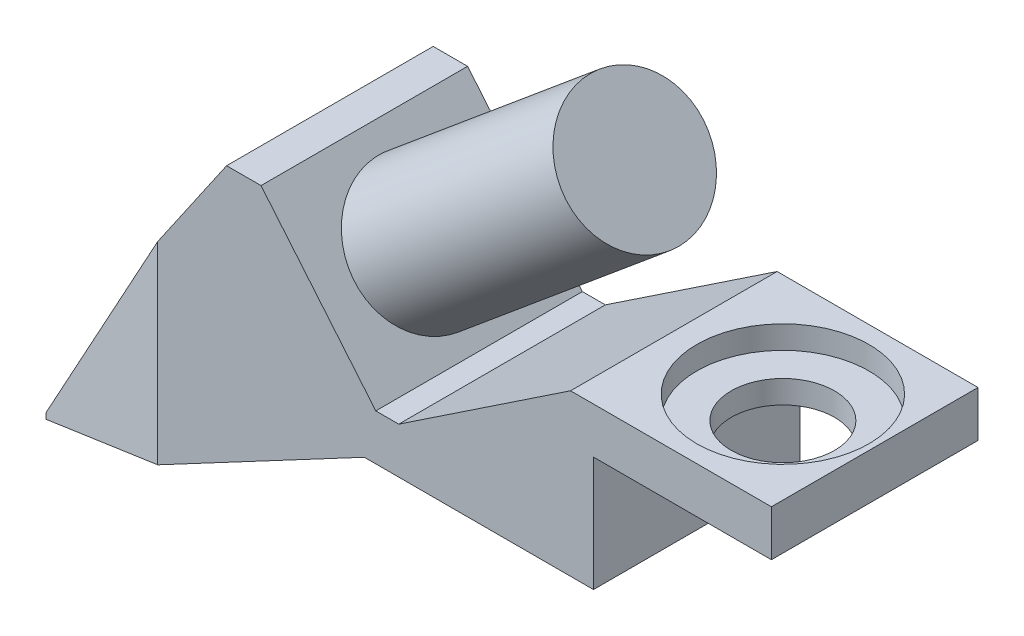
ISO-10303-21;
HEADER;
FILE_DESCRIPTION(('STEP AP214'),'2;1');
FILE_NAME('part.step','',(''),(''),'','','');
FILE_SCHEMA(('AUTOMOTIVE_DESIGN { 1 0 10303 214 1 1 1 1 }'));
ENDSEC;
DATA;
#1=APPLICATION_CONTEXT('core data for automotive mechanical design processes');
#2=APPLICATION_PROTOCOL_DEFINITION('international standard','automotive_design',2000,#1);
#3=PRODUCT_CONTEXT('',#1,'mechanical');
#4=PRODUCT('Part','Part','',(#3));
#5=PRODUCT_RELATED_PRODUCT_CATEGORY('part','',(#4));
#6=PRODUCT_DEFINITION_FORMATION('','',#4);
#7=PRODUCT_DEFINITION_CONTEXT('part definition',#1,'design');
#8=PRODUCT_DEFINITION('design','',#6,#7);
#9=PRODUCT_DEFINITION_SHAPE('','',#8);
#10=(LENGTH_UNIT() NAMED_UNIT(*) SI_UNIT(.MILLI.,.METRE.));
#11=(NAMED_UNIT(*) PLANE_ANGLE_UNIT() SI_UNIT($,.RADIAN.));
#12=(NAMED_UNIT(*) SI_UNIT($,.STERADIAN.) SOLID_ANGLE_UNIT());
#13=UNCERTAINTY_MEASURE_WITH_UNIT(LENGTH_MEASURE(1.E-05),#10,'distance_accuracy_value','');
#14=(GEOMETRIC_REPRESENTATION_CONTEXT(3) GLOBAL_UNCERTAINTY_ASSIGNED_CONTEXT((#13)) GLOBAL_UNIT_ASSIGNED_CONTEXT((#10,
#11,#12)) REPRESENTATION_CONTEXT('',''));
#15=CARTESIAN_POINT('',(0.,0.,0.));
#16=DIRECTION('',(0.,0.,1.));
#17=DIRECTION('',(1.,0.,0.));
#18=AXIS2_PLACEMENT_3D('',#15,#16,#17);
#19=CARTESIAN_POINT('',(31.6,0.,4.5));
#20=DIRECTION('',(0.,1.,0.));
#21=DIRECTION('',(0.,0.,1.));
#22=AXIS2_PLACEMENT_3D('',#19,#20,#21);
#23=CYLINDRICAL_SURFACE('',#22,2.25);
#24=CARTESIAN_POINT('',(31.6,14.5,4.5));
#25=DIRECTION('',(0.,1.,0.));
#26=DIRECTION('',(0.,0.,1.));
#27=AXIS2_PLACEMENT_3D('',#24,#25,#26);
#28=CIRCLE('',#27,2.25);
#29=CARTESIAN_POINT('',(31.6,14.5,6.75));
#30=VERTEX_POINT('',#29);
#31=EDGE_CURVE('E186',#30,#30,#28,.T.);
#32=ORIENTED_EDGE('',*,*,#31,.F.);
#33=EDGE_LOOP('',(#32));
#34=FACE_BOUND('',#33,.T.);
#35=CARTESIAN_POINT('',(31.6,15.5,4.5));
#36=DIRECTION('',(0.,1.,0.));
#37=DIRECTION('',(0.,0.,1.));
#38=AXIS2_PLACEMENT_3D('',#35,#36,#37);
#39=CIRCLE('',#38,2.25);
#40=CARTESIAN_POINT('',(31.6,15.5,6.75));
#41=VERTEX_POINT('',#40);
#42=EDGE_CURVE('E339',#41,#41,#39,.T.);
#43=ORIENTED_EDGE('',*,*,#42,.T.);
#44=EDGE_LOOP('',(#43));
#45=FACE_BOUND('',#44,.T.);
#46=ADVANCED_FACE('F41',(#34,#45),#23,.F.);
#47=CARTESIAN_POINT('',(0.,0.,9.));
#48=DIRECTION('',(1.,0.,0.));
#49=DIRECTION('',(0.,0.,-1.));
#50=AXIS2_PLACEMENT_3D('',#47,#48,#49);
#51=PLANE('',#50);
#52=DIRECTION('',(0.,0.,-1.));
#53=VECTOR('',#52,1.);
#54=CARTESIAN_POINT('',(0.,0.25,9.));
#55=LINE('',#54,#53);
#56=CARTESIAN_POINT('',(0.,0.25,5.));
#57=VERTEX_POINT('',#56);
#58=CARTESIAN_POINT('',(0.,0.250000000000007,4.));
#59=VERTEX_POINT('',#58);
#60=EDGE_CURVE('E156',#57,#59,#55,.T.);
#61=ORIENTED_EDGE('',*,*,#60,.T.);
#62=DIRECTION('',(0.,1.,0.));
#63=VECTOR('',#62,1.);
#64=CARTESIAN_POINT('',(0.,0.,4.));
#65=LINE('',#64,#63);
#66=CARTESIAN_POINT('',(0.,0.,4.));
#67=VERTEX_POINT('',#66);
#68=EDGE_CURVE('E143',#67,#59,#65,.T.);
#69=ORIENTED_EDGE('',*,*,#68,.F.);
#70=DIRECTION('',(0.,0.,-1.));
#71=VECTOR('',#70,1.);
#72=CARTESIAN_POINT('',(0.,0.,9.));
#73=LINE('',#72,#71);
#74=CARTESIAN_POINT('',(0.,0.,5.));
#75=VERTEX_POINT('',#74);
#76=EDGE_CURVE('E154',#75,#67,#73,.T.);
#77=ORIENTED_EDGE('',*,*,#76,.F.);
#78=DIRECTION('',(0.,1.,0.));
#79=VECTOR('',#78,1.);
#80=CARTESIAN_POINT('',(0.,0.,5.));
#81=LINE('',#80,#79);
#82=EDGE_CURVE('E157',#75,#57,#81,.T.);
#83=ORIENTED_EDGE('',*,*,#82,.T.);
#84=EDGE_LOOP('',(#61,#69,#77,#83));
#85=FACE_BOUND('',#84,.T.);
#86=ADVANCED_FACE('F43',(#85),#51,.F.);
#87=CARTESIAN_POINT('',(0.,0.,9.));
#88=DIRECTION('',(-0.469475991500932,0.882945238055122,0.));
#89=DIRECTION('',(-0.882945238055122,-0.469475991500932,0.));
#90=AXIS2_PLACEMENT_3D('',#87,#88,#89);
#91=PLANE('',#90);
#92=ORIENTED_EDGE('',*,*,#76,.T.);
#93=DIRECTION('',(0.820268310076232,0.436149674489542,-0.37004507958808));
#94=VECTOR('',#93,1.);
#95=CARTESIAN_POINT('',(-1.5176812604287,-0.80697520504399,4.68466680463674));
#96=LINE('',#95,#94);
#97=CARTESIAN_POINT('',(8.86668522645211,4.71455720989505,0.));
#98=VERTEX_POINT('',#97);
#99=EDGE_CURVE('E140',#67,#98,#96,.T.);
#100=ORIENTED_EDGE('',*,*,#99,.T.);
#101=DIRECTION('',(0.882945238055122,0.469475991500932,0.));
#102=VECTOR('',#101,1.);
#103=CARTESIAN_POINT('',(0.,0.,0.));
#104=LINE('',#103,#102);
#105=CARTESIAN_POINT('',(17.8666852264521,9.5,0.));
#106=VERTEX_POINT('',#105);
#107=EDGE_CURVE('E205',#98,#106,#104,.T.);
#108=ORIENTED_EDGE('',*,*,#107,.T.);
#109=DIRECTION('',(0.,0.,-1.));
#110=VECTOR('',#109,1.);
#111=CARTESIAN_POINT('',(17.8666852264521,9.5,9.));
#112=LINE('',#111,#110);
#113=CARTESIAN_POINT('',(17.8666852264521,9.5,9.));
#114=VERTEX_POINT('',#113);
#115=EDGE_CURVE('E161',#114,#106,#112,.T.);
#116=ORIENTED_EDGE('',*,*,#115,.F.);
#117=DIRECTION('',(0.882945238055122,0.469475991500932,0.));
#118=VECTOR('',#117,1.);
#119=CARTESIAN_POINT('',(0.,0.,9.));
#120=LINE('',#119,#118);
#121=CARTESIAN_POINT('',(8.86668522645211,4.71455720989504,9.));
#122=VERTEX_POINT('',#121);
#123=EDGE_CURVE('E171',#122,#114,#120,.T.);
#124=ORIENTED_EDGE('',*,*,#123,.F.);
#125=DIRECTION('',(0.820268310076232,0.436149674489542,0.37004507958808));
#126=VECTOR('',#125,1.);
#127=CARTESIAN_POINT('',(1.21414500834296,0.645580164035192,5.54773344370939));
#128=LINE('',#127,#126);
#129=EDGE_CURVE('E56',#75,#122,#128,.T.);
#130=ORIENTED_EDGE('',*,*,#129,.F.);
#131=EDGE_LOOP('',(#92,#100,#108,#116,#124,#130));
#132=FACE_BOUND('',#131,.T.);
#133=ADVANCED_FACE('F159',(#132),#91,.F.);
#134=CARTESIAN_POINT('',(11.8666852264521,17.5,9.));
#135=DIRECTION('',(0.823878894288954,-0.566765884246054,0.));
#136=DIRECTION('',(0.566765884246054,0.823878894288954,0.));
#137=AXIS2_PLACEMENT_3D('',#134,#135,#136);
#138=PLANE('',#137);
#139=DIRECTION('',(-0.566765884246054,-0.823878894288954,0.));
#140=VECTOR('',#139,1.);
#141=CARTESIAN_POINT('',(11.8666852264521,17.5,0.));
#142=LINE('',#141,#140);
#143=CARTESIAN_POINT('',(11.8666852264521,17.5,0.));
#144=VERTEX_POINT('',#143);
#145=CARTESIAN_POINT('',(8.86668522645211,13.1390517644604,0.));
#146=VERTEX_POINT('',#145);
#147=EDGE_CURVE('E178',#144,#146,#142,.T.);
#148=ORIENTED_EDGE('',*,*,#147,.T.);
#149=DIRECTION('',(-0.549101539759478,-0.798201130315389,0.247714461824509));
#150=VECTOR('',#149,1.);
#151=CARTESIAN_POINT('',(10.4584143309843,15.4528678410827,-0.718071777165876));
#152=LINE('',#151,#150);
#153=EDGE_CURVE('E64',#146,#59,#152,.T.);
#154=ORIENTED_EDGE('',*,*,#153,.T.);
#155=ORIENTED_EDGE('',*,*,#60,.F.);
#156=DIRECTION('',(-0.549101539759478,-0.798201130315389,-0.247714461824509));
#157=VECTOR('',#156,1.);
#158=CARTESIAN_POINT('',(11.6825978626611,17.2324015118968,10.2703338685389));
#159=LINE('',#158,#157);
#160=CARTESIAN_POINT('',(8.86668522645211,13.1390517644604,9.));
#161=VERTEX_POINT('',#160);
#162=EDGE_CURVE('E148',#161,#57,#159,.T.);
#163=ORIENTED_EDGE('',*,*,#162,.F.);
#164=DIRECTION('',(-0.566765884246054,-0.823878894288954,0.));
#165=VECTOR('',#164,1.);
#166=CARTESIAN_POINT('',(11.8666852264521,17.5,9.));
#167=LINE('',#166,#165);
#168=CARTESIAN_POINT('',(11.8666852264521,17.5,9.));
#169=VERTEX_POINT('',#168);
#170=EDGE_CURVE('E174',#169,#161,#167,.T.);
#171=ORIENTED_EDGE('',*,*,#170,.F.);
#172=DIRECTION('',(0.,0.,-1.));
#173=VECTOR('',#172,1.);
#174=CARTESIAN_POINT('',(11.8666852264521,17.5,9.));
#175=LINE('',#174,#173);
#176=EDGE_CURVE('E225',#169,#144,#175,.T.);
#177=ORIENTED_EDGE('',*,*,#176,.T.);
#178=EDGE_LOOP('',(#148,#154,#155,#163,#171,#177));
#179=FACE_BOUND('',#178,.T.);
#180=ADVANCED_FACE('F280',(#179),#138,.F.);
#181=CARTESIAN_POINT('',(0.,0.,9.));
#182=DIRECTION('',(0.,0.,1.));
#183=DIRECTION('',(1.,0.,0.));
#184=AXIS2_PLACEMENT_3D('',#181,#182,#183);
#185=PLANE('',#184);
#186=ORIENTED_EDGE('',*,*,#170,.T.);
#187=DIRECTION('',(0.,-1.,0.));
#188=VECTOR('',#187,1.);
#189=CARTESIAN_POINT('',(8.86668522645211,0.,9.));
#190=LINE('',#189,#188);
#191=EDGE_CURVE('E49',#161,#122,#190,.T.);
#192=ORIENTED_EDGE('',*,*,#191,.T.);
#193=ORIENTED_EDGE('',*,*,#123,.T.);
#194=DIRECTION('',(1.,0.,0.));
#195=VECTOR('',#194,1.);
#196=CARTESIAN_POINT('',(17.8666852264521,9.5,9.));
#197=LINE('',#196,#195);
#198=CARTESIAN_POINT('',(27.85,9.5,9.));
#199=VERTEX_POINT('',#198);
#200=EDGE_CURVE('E177',#114,#199,#197,.T.);
#201=ORIENTED_EDGE('',*,*,#200,.T.);
#202=DIRECTION('',(0.,1.,0.));
#203=VECTOR('',#202,1.);
#204=CARTESIAN_POINT('',(27.85,9.5,9.));
#205=LINE('',#204,#203);
#206=CARTESIAN_POINT('',(27.85,14.5,9.));
#207=VERTEX_POINT('',#206);
#208=EDGE_CURVE('E180',#199,#207,#205,.T.);
#209=ORIENTED_EDGE('',*,*,#208,.T.);
#210=DIRECTION('',(1.,0.,0.));
#211=VECTOR('',#210,1.);
#212=CARTESIAN_POINT('',(27.85,14.5,9.));
#213=LINE('',#212,#211);
#214=CARTESIAN_POINT('',(35.6,14.5,9.));
#215=VERTEX_POINT('',#214);
#216=EDGE_CURVE('E190',#207,#215,#213,.T.);
#217=ORIENTED_EDGE('',*,*,#216,.T.);
#218=DIRECTION('',(0.,1.,0.));
#219=VECTOR('',#218,1.);
#220=CARTESIAN_POINT('',(35.6,14.5,9.));
#221=LINE('',#220,#219);
#222=CARTESIAN_POINT('',(35.6,16.5,9.));
#223=VERTEX_POINT('',#222);
#224=EDGE_CURVE('E192',#215,#223,#221,.T.);
#225=ORIENTED_EDGE('',*,*,#224,.T.);
#226=DIRECTION('',(-1.,0.,0.));
#227=VECTOR('',#226,1.);
#228=CARTESIAN_POINT('',(35.6,16.5,9.));
#229=LINE('',#228,#227);
#230=CARTESIAN_POINT('',(26.85,16.5,9.));
#231=VERTEX_POINT('',#230);
#232=EDGE_CURVE('E194',#223,#231,#229,.T.);
#233=ORIENTED_EDGE('',*,*,#232,.T.);
#234=DIRECTION('',(-0.831479419283098,-0.555555555555556,0.));
#235=VECTOR('',#234,1.);
#236=CARTESIAN_POINT('',(26.85,16.5,9.));
#237=LINE('',#236,#235);
#238=CARTESIAN_POINT('',(19.3666852264521,11.5,9.));
#239=VERTEX_POINT('',#238);
#240=EDGE_CURVE('E196',#231,#239,#237,.T.);
#241=ORIENTED_EDGE('',*,*,#240,.T.);
#242=DIRECTION('',(-1.,0.,0.));
#243=VECTOR('',#242,1.);
#244=CARTESIAN_POINT('',(19.3666852264521,11.5,9.));
#245=LINE('',#244,#243);
#246=CARTESIAN_POINT('',(18.3666852264521,11.5,9.));
#247=VERTEX_POINT('',#246);
#248=EDGE_CURVE('E198',#239,#247,#245,.T.);
#249=ORIENTED_EDGE('',*,*,#248,.T.);
#250=DIRECTION('',(-0.64018439966448,0.768221279597376,0.));
#251=VECTOR('',#250,1.);
#252=CARTESIAN_POINT('',(18.3666852264521,11.5,9.));
#253=LINE('',#252,#251);
#254=CARTESIAN_POINT('',(13.3666852264521,17.5,9.));
#255=VERTEX_POINT('',#254);
#256=EDGE_CURVE('E200',#247,#255,#253,.T.);
#257=ORIENTED_EDGE('',*,*,#256,.T.);
#258=DIRECTION('',(-1.,0.,0.));
#259=VECTOR('',#258,1.);
#260=CARTESIAN_POINT('',(13.3666852264521,17.5,9.));
#261=LINE('',#260,#259);
#262=EDGE_CURVE('E202',#255,#169,#261,.T.);
#263=ORIENTED_EDGE('',*,*,#262,.T.);
#264=EDGE_LOOP('',(#186,#192,#193,#201,#209,#217,#225,#233,#241,#249,#257,#263));
#265=FACE_BOUND('',#264,.T.);
#266=ADVANCED_FACE('F170',(#265),#185,.T.);
#267=CARTESIAN_POINT('',(17.8666852264521,9.5,9.));
#268=DIRECTION('',(0.,1.,0.));
#269=DIRECTION('',(0.,0.,1.));
#270=AXIS2_PLACEMENT_3D('',#267,#268,#269);
#271=PLANE('',#270);
#272=DIRECTION('',(1.,0.,0.));
#273=VECTOR('',#272,1.);
#274=CARTESIAN_POINT('',(17.8666852264521,9.5,0.));
#275=LINE('',#274,#273);
#276=CARTESIAN_POINT('',(27.85,9.5,0.));
#277=VERTEX_POINT('',#276);
#278=EDGE_CURVE('E207',#106,#277,#275,.T.);
#279=ORIENTED_EDGE('',*,*,#278,.T.);
#280=DIRECTION('',(0.,0.,-1.));
#281=VECTOR('',#280,1.);
#282=CARTESIAN_POINT('',(27.85,9.5,9.));
#283=LINE('',#282,#281);
#284=EDGE_CURVE('E165',#199,#277,#283,.T.);
#285=ORIENTED_EDGE('',*,*,#284,.F.);
#286=ORIENTED_EDGE('',*,*,#200,.F.);
#287=ORIENTED_EDGE('',*,*,#115,.T.);
#288=EDGE_LOOP('',(#279,#285,#286,#287));
#289=FACE_BOUND('',#288,.T.);
#290=ADVANCED_FACE('F272',(#289),#271,.F.);
#291=CARTESIAN_POINT('',(27.85,9.5,9.));
#292=DIRECTION('',(-1.,0.,0.));
#293=DIRECTION('',(0.,0.,1.));
#294=AXIS2_PLACEMENT_3D('',#291,#292,#293);
#295=PLANE('',#294);
#296=DIRECTION('',(0.,1.,0.));
#297=VECTOR('',#296,1.);
#298=CARTESIAN_POINT('',(27.85,9.5,0.));
#299=LINE('',#298,#297);
#300=CARTESIAN_POINT('',(27.85,14.5,0.));
#301=VERTEX_POINT('',#300);
#302=EDGE_CURVE('E209',#277,#301,#299,.T.);
#303=ORIENTED_EDGE('',*,*,#302,.T.);
#304=DIRECTION('',(0.,0.,-1.));
#305=VECTOR('',#304,1.);
#306=CARTESIAN_POINT('',(27.85,14.5,9.));
#307=LINE('',#306,#305);
#308=EDGE_CURVE('E246',#207,#301,#307,.T.);
#309=ORIENTED_EDGE('',*,*,#308,.F.);
#310=ORIENTED_EDGE('',*,*,#208,.F.);
#311=ORIENTED_EDGE('',*,*,#284,.T.);
#312=EDGE_LOOP('',(#303,#309,#310,#311));
#313=FACE_BOUND('',#312,.T.);
#314=ADVANCED_FACE('F253',(#313),#295,.F.);
#315=CARTESIAN_POINT('',(27.85,14.5,9.));
#316=DIRECTION('',(0.,1.,0.));
#317=DIRECTION('',(0.,0.,1.));
#318=AXIS2_PLACEMENT_3D('',#315,#316,#317);
#319=PLANE('',#318);
#320=ORIENTED_EDGE('',*,*,#31,.T.);
#321=EDGE_LOOP('',(#320));
#322=FACE_BOUND('',#321,.T.);
#323=DIRECTION('',(1.,0.,0.));
#324=VECTOR('',#323,1.);
#325=CARTESIAN_POINT('',(27.85,14.5,0.));
#326=LINE('',#325,#324);
#327=CARTESIAN_POINT('',(35.6,14.5,0.));
#328=VERTEX_POINT('',#327);
#329=EDGE_CURVE('E211',#301,#328,#326,.T.);
#330=ORIENTED_EDGE('',*,*,#329,.T.);
#331=DIRECTION('',(0.,0.,-1.));
#332=VECTOR('',#331,1.);
#333=CARTESIAN_POINT('',(35.6,14.5,9.));
#334=LINE('',#333,#332);
#335=EDGE_CURVE('E243',#215,#328,#334,.T.);
#336=ORIENTED_EDGE('',*,*,#335,.F.);
#337=ORIENTED_EDGE('',*,*,#216,.F.);
#338=ORIENTED_EDGE('',*,*,#308,.T.);
#339=EDGE_LOOP('',(#330,#336,#337,#338));
#340=FACE_BOUND('',#339,.T.);
#341=ADVANCED_FACE('F264',(#322,#340),#319,.F.);
#342=CARTESIAN_POINT('',(35.6,14.5,9.));
#343=DIRECTION('',(-1.,0.,0.));
#344=DIRECTION('',(0.,0.,1.));
#345=AXIS2_PLACEMENT_3D('',#342,#343,#344);
#346=PLANE('',#345);
#347=DIRECTION('',(0.,1.,0.));
#348=VECTOR('',#347,1.);
#349=CARTESIAN_POINT('',(35.6,14.5,0.));
#350=LINE('',#349,#348);
#351=CARTESIAN_POINT('',(35.6,16.5,0.));
#352=VERTEX_POINT('',#351);
#353=EDGE_CURVE('E213',#328,#352,#350,.T.);
#354=ORIENTED_EDGE('',*,*,#353,.T.);
#355=DIRECTION('',(0.,0.,-1.));
#356=VECTOR('',#355,1.);
#357=CARTESIAN_POINT('',(35.6,16.5,9.));
#358=LINE('',#357,#356);
#359=EDGE_CURVE('E240',#223,#352,#358,.T.);
#360=ORIENTED_EDGE('',*,*,#359,.F.);
#361=ORIENTED_EDGE('',*,*,#224,.F.);
#362=ORIENTED_EDGE('',*,*,#335,.T.);
#363=EDGE_LOOP('',(#354,#360,#361,#362));
#364=FACE_BOUND('',#363,.T.);
#365=ADVANCED_FACE('F268',(#364),#346,.F.);
#366=CARTESIAN_POINT('',(35.6,16.5,9.));
#367=DIRECTION('',(0.,-1.,0.));
#368=DIRECTION('',(0.,0.,-1.));
#369=AXIS2_PLACEMENT_3D('',#366,#367,#368);
#370=PLANE('',#369);
#371=CARTESIAN_POINT('',(31.6,16.5,4.5));
#372=DIRECTION('',(0.,1.,0.));
#373=DIRECTION('',(0.,0.,1.));
#374=AXIS2_PLACEMENT_3D('',#371,#372,#373);
#375=CIRCLE('',#374,3.75000000000001);
#376=CARTESIAN_POINT('',(31.6,16.5,8.25000000000001));
#377=VERTEX_POINT('',#376);
#378=EDGE_CURVE('E336',#377,#377,#375,.T.);
#379=ORIENTED_EDGE('',*,*,#378,.F.);
#380=EDGE_LOOP('',(#379));
#381=FACE_BOUND('',#380,.T.);
#382=DIRECTION('',(-1.,0.,0.));
#383=VECTOR('',#382,1.);
#384=CARTESIAN_POINT('',(35.6,16.5,0.));
#385=LINE('',#384,#383);
#386=CARTESIAN_POINT('',(26.85,16.5,0.));
#387=VERTEX_POINT('',#386);
#388=EDGE_CURVE('E215',#352,#387,#385,.T.);
#389=ORIENTED_EDGE('',*,*,#388,.T.);
#390=DIRECTION('',(0.,0.,-1.));
#391=VECTOR('',#390,1.);
#392=CARTESIAN_POINT('',(26.85,16.5,9.));
#393=LINE('',#392,#391);
#394=EDGE_CURVE('E237',#231,#387,#393,.T.);
#395=ORIENTED_EDGE('',*,*,#394,.F.);
#396=ORIENTED_EDGE('',*,*,#232,.F.);
#397=ORIENTED_EDGE('',*,*,#359,.T.);
#398=EDGE_LOOP('',(#389,#395,#396,#397));
#399=FACE_BOUND('',#398,.T.);
#400=ADVANCED_FACE('F319',(#381,#399),#370,.F.);
#401=CARTESIAN_POINT('',(26.85,16.5,9.));
#402=DIRECTION('',(0.555555555555556,-0.831479419283098,0.));
#403=DIRECTION('',(0.831479419283098,0.555555555555556,0.));
#404=AXIS2_PLACEMENT_3D('',#401,#402,#403);
#405=PLANE('',#404);
#406=DIRECTION('',(-0.831479419283098,-0.555555555555556,0.));
#407=VECTOR('',#406,1.);
#408=CARTESIAN_POINT('',(26.85,16.5,0.));
#409=LINE('',#408,#407);
#410=CARTESIAN_POINT('',(19.3666852264521,11.5,0.));
#411=VERTEX_POINT('',#410);
#412=EDGE_CURVE('E217',#387,#411,#409,.T.);
#413=ORIENTED_EDGE('',*,*,#412,.T.);
#414=DIRECTION('',(0.,0.,-1.));
#415=VECTOR('',#414,1.);
#416=CARTESIAN_POINT('',(19.3666852264521,11.5,9.));
#417=LINE('',#416,#415);
#418=EDGE_CURVE('E234',#239,#411,#417,.T.);
#419=ORIENTED_EDGE('',*,*,#418,.F.);
#420=ORIENTED_EDGE('',*,*,#240,.F.);
#421=ORIENTED_EDGE('',*,*,#394,.T.);
#422=EDGE_LOOP('',(#413,#419,#420,#421));
#423=FACE_BOUND('',#422,.T.);
#424=ADVANCED_FACE('F315',(#423),#405,.F.);
#425=CARTESIAN_POINT('',(19.3666852264521,11.5,9.));
#426=DIRECTION('',(0.,-1.,0.));
#427=DIRECTION('',(0.,0.,-1.));
#428=AXIS2_PLACEMENT_3D('',#425,#426,#427);
#429=PLANE('',#428);
#430=DIRECTION('',(-1.,0.,0.));
#431=VECTOR('',#430,1.);
#432=CARTESIAN_POINT('',(19.3666852264521,11.5,0.));
#433=LINE('',#432,#431);
#434=CARTESIAN_POINT('',(18.3666852264521,11.5,0.));
#435=VERTEX_POINT('',#434);
#436=EDGE_CURVE('E219',#411,#435,#433,.T.);
#437=ORIENTED_EDGE('',*,*,#436,.T.);
#438=DIRECTION('',(0.,0.,-1.));
#439=VECTOR('',#438,1.);
#440=CARTESIAN_POINT('',(18.3666852264521,11.5,9.));
#441=LINE('',#440,#439);
#442=EDGE_CURVE('E231',#247,#435,#441,.T.);
#443=ORIENTED_EDGE('',*,*,#442,.F.);
#444=ORIENTED_EDGE('',*,*,#248,.F.);
#445=ORIENTED_EDGE('',*,*,#418,.T.);
#446=EDGE_LOOP('',(#437,#443,#444,#445));
#447=FACE_BOUND('',#446,.T.);
#448=ADVANCED_FACE('F311',(#447),#429,.F.);
#449=CARTESIAN_POINT('',(18.3666852264521,11.5,9.));
#450=DIRECTION('',(-0.768221279597376,-0.64018439966448,0.));
#451=DIRECTION('',(0.64018439966448,-0.768221279597376,0.));
#452=AXIS2_PLACEMENT_3D('',#449,#450,#451);
#453=PLANE('',#452);
#454=CARTESIAN_POINT('',(15.92742282511,14.4271148816105,4.5));
#455=DIRECTION('',(-0.768221279597376,-0.64018439966448,0.));
#456=DIRECTION('',(0.64018439966448,-0.768221279597376,0.));
#457=AXIS2_PLACEMENT_3D('',#454,#455,#456);
#458=CIRCLE('',#457,3.);
#459=CARTESIAN_POINT('',(17.8479760241035,12.1224510428184,4.5));
#460=VERTEX_POINT('',#459);
#461=EDGE_CURVE('E11',#460,#460,#458,.F.);
#462=ORIENTED_EDGE('',*,*,#461,.F.);
#463=EDGE_LOOP('',(#462));
#464=FACE_BOUND('',#463,.T.);
#465=DIRECTION('',(-0.64018439966448,0.768221279597376,0.));
#466=VECTOR('',#465,1.);
#467=CARTESIAN_POINT('',(18.3666852264521,11.5,0.));
#468=LINE('',#467,#466);
#469=CARTESIAN_POINT('',(13.3666852264521,17.5,0.));
#470=VERTEX_POINT('',#469);
#471=EDGE_CURVE('E221',#435,#470,#468,.T.);
#472=ORIENTED_EDGE('',*,*,#471,.T.);
#473=DIRECTION('',(0.,0.,-1.));
#474=VECTOR('',#473,1.);
#475=CARTESIAN_POINT('',(13.3666852264521,17.5,9.));
#476=LINE('',#475,#474);
#477=EDGE_CURVE('E228',#255,#470,#476,.T.);
#478=ORIENTED_EDGE('',*,*,#477,.F.);
#479=ORIENTED_EDGE('',*,*,#256,.F.);
#480=ORIENTED_EDGE('',*,*,#442,.T.);
#481=EDGE_LOOP('',(#472,#478,#479,#480));
#482=FACE_BOUND('',#481,.T.);
#483=ADVANCED_FACE('F307',(#464,#482),#453,.F.);
#484=CARTESIAN_POINT('',(13.3666852264521,17.5,9.));
#485=DIRECTION('',(0.,-1.,0.));
#486=DIRECTION('',(0.,0.,-1.));
#487=AXIS2_PLACEMENT_3D('',#484,#485,#486);
#488=PLANE('',#487);
#489=DIRECTION('',(-1.,0.,0.));
#490=VECTOR('',#489,1.);
#491=CARTESIAN_POINT('',(13.3666852264521,17.5,0.));
#492=LINE('',#491,#490);
#493=EDGE_CURVE('E183',#470,#144,#492,.T.);
#494=ORIENTED_EDGE('',*,*,#493,.T.);
#495=ORIENTED_EDGE('',*,*,#176,.F.);
#496=ORIENTED_EDGE('',*,*,#262,.F.);
#497=ORIENTED_EDGE('',*,*,#477,.T.);
#498=EDGE_LOOP('',(#494,#495,#496,#497));
#499=FACE_BOUND('',#498,.T.);
#500=ADVANCED_FACE('F301',(#499),#488,.F.);
#501=CARTESIAN_POINT('',(0.,0.,0.));
#502=DIRECTION('',(0.,0.,1.));
#503=DIRECTION('',(1.,0.,0.));
#504=AXIS2_PLACEMENT_3D('',#501,#502,#503);
#505=PLANE('',#504);
#506=ORIENTED_EDGE('',*,*,#107,.F.);
#507=DIRECTION('',(0.,1.,0.));
#508=VECTOR('',#507,1.);
#509=CARTESIAN_POINT('',(8.86668522645211,0.,0.));
#510=LINE('',#509,#508);
#511=EDGE_CURVE('E144',#98,#146,#510,.T.);
#512=ORIENTED_EDGE('',*,*,#511,.T.);
#513=ORIENTED_EDGE('',*,*,#147,.F.);
#514=ORIENTED_EDGE('',*,*,#493,.F.);
#515=ORIENTED_EDGE('',*,*,#471,.F.);
#516=ORIENTED_EDGE('',*,*,#436,.F.);
#517=ORIENTED_EDGE('',*,*,#412,.F.);
#518=ORIENTED_EDGE('',*,*,#388,.F.);
#519=ORIENTED_EDGE('',*,*,#353,.F.);
#520=ORIENTED_EDGE('',*,*,#329,.F.);
#521=ORIENTED_EDGE('',*,*,#302,.F.);
#522=ORIENTED_EDGE('',*,*,#278,.F.);
#523=EDGE_LOOP('',(#506,#512,#513,#514,#515,#516,#517,#518,#519,#520,#521,#522));
#524=FACE_BOUND('',#523,.T.);
#525=ADVANCED_FACE('F259',(#524),#505,.F.);
#526=CARTESIAN_POINT('',(1.4993637926586,0.,3.3235966973608));
#527=DIRECTION('',(0.411218707818357,0.,0.911536710363439));
#528=DIRECTION('',(0.911536710363439,0.,-0.411218707818357));
#529=AXIS2_PLACEMENT_3D('',#526,#527,#528);
#530=PLANE('',#529);
#531=ORIENTED_EDGE('',*,*,#68,.T.);
#532=ORIENTED_EDGE('',*,*,#153,.F.);
#533=ORIENTED_EDGE('',*,*,#511,.F.);
#534=ORIENTED_EDGE('',*,*,#99,.F.);
#535=EDGE_LOOP('',(#531,#532,#533,#534));
#536=FACE_BOUND('',#535,.T.);
#537=ADVANCED_FACE('F142',(#536),#530,.F.);
#538=CARTESIAN_POINT('',(-1.87420474082325,0.,4.154495871701));
#539=DIRECTION('',(-0.411218707818357,0.,0.911536710363439));
#540=DIRECTION('',(0.911536710363439,0.,0.411218707818357));
#541=AXIS2_PLACEMENT_3D('',#538,#539,#540);
#542=PLANE('',#541);
#543=ORIENTED_EDGE('',*,*,#129,.T.);
#544=ORIENTED_EDGE('',*,*,#191,.F.);
#545=ORIENTED_EDGE('',*,*,#162,.T.);
#546=ORIENTED_EDGE('',*,*,#82,.F.);
#547=EDGE_LOOP('',(#543,#544,#545,#546));
#548=FACE_BOUND('',#547,.T.);
#549=ADVANCED_FACE('F296',(#548),#542,.T.);
#550=CARTESIAN_POINT('',(31.6,15.5,4.5));
#551=DIRECTION('',(0.,1.,0.));
#552=DIRECTION('',(0.,0.,1.));
#553=AXIS2_PLACEMENT_3D('',#550,#551,#552);
#554=CYLINDRICAL_SURFACE('',#553,3.75000000000001);
#555=CARTESIAN_POINT('',(31.6,15.5,4.5));
#556=DIRECTION('',(0.,1.,0.));
#557=DIRECTION('',(0.,0.,1.));
#558=AXIS2_PLACEMENT_3D('',#555,#556,#557);
#559=CIRCLE('',#558,3.75000000000001);
#560=CARTESIAN_POINT('',(31.6,15.5,8.25000000000001));
#561=VERTEX_POINT('',#560);
#562=EDGE_CURVE('E334',#561,#561,#559,.T.);
#563=ORIENTED_EDGE('',*,*,#562,.F.);
#564=EDGE_LOOP('',(#563));
#565=FACE_BOUND('',#564,.T.);
#566=ORIENTED_EDGE('',*,*,#378,.T.);
#567=EDGE_LOOP('',(#566));
#568=FACE_BOUND('',#567,.T.);
#569=ADVANCED_FACE('F292',(#565,#568),#554,.F.);
#570=CARTESIAN_POINT('',(0.,15.5,0.));
#571=DIRECTION('',(0.,1.,0.));
#572=DIRECTION('',(0.,0.,1.));
#573=AXIS2_PLACEMENT_3D('',#570,#571,#572);
#574=PLANE('',#573);
#575=ORIENTED_EDGE('',*,*,#42,.F.);
#576=EDGE_LOOP('',(#575));
#577=FACE_BOUND('',#576,.T.);
#578=ORIENTED_EDGE('',*,*,#562,.T.);
#579=EDGE_LOOP('',(#578));
#580=FACE_BOUND('',#579,.T.);
#581=ADVANCED_FACE('F353',(#577,#580),#574,.T.);
#582=CARTESIAN_POINT('',(25.1460781802785,22.1093276775843,4.5));
#583=DIRECTION('',(-0.768221279597376,-0.64018439966448,0.));
#584=DIRECTION('',(0.64018439966448,-0.768221279597376,0.));
#585=AXIS2_PLACEMENT_3D('',#582,#583,#584);
#586=CYLINDRICAL_SURFACE('',#585,3.);
#587=CARTESIAN_POINT('',(25.1460781802785,22.1093276775843,4.5));
#588=DIRECTION('',(0.768221279597376,0.64018439966448,0.));
#589=DIRECTION('',(-0.64018439966448,0.768221279597376,0.));
#590=AXIS2_PLACEMENT_3D('',#587,#588,#589);
#591=CIRCLE('',#590,3.);
#592=CARTESIAN_POINT('',(23.2255249812851,24.4139915163764,4.5));
#593=VERTEX_POINT('',#592);
#594=EDGE_CURVE('E340',#593,#593,#591,.T.);
#595=ORIENTED_EDGE('',*,*,#594,.F.);
#596=EDGE_LOOP('',(#595));
#597=FACE_BOUND('',#596,.T.);
#598=ORIENTED_EDGE('',*,*,#461,.T.);
#599=EDGE_LOOP('',(#598));
#600=FACE_BOUND('',#599,.T.);
#601=ADVANCED_FACE('F350',(#597,#600),#586,.T.);
#602=CARTESIAN_POINT('',(25.1460781802785,22.1093276775843,4.5));
#603=DIRECTION('',(0.768221279597376,0.64018439966448,0.));
#604=DIRECTION('',(-0.64018439966448,0.768221279597376,0.));
#605=AXIS2_PLACEMENT_3D('',#602,#603,#604);
#606=PLANE('',#605);
#607=ORIENTED_EDGE('',*,*,#594,.T.);
#608=EDGE_LOOP('',(#607));
#609=FACE_BOUND('',#608,.T.);
#610=ADVANCED_FACE('F348',(#609),#606,.T.);
#611=CLOSED_SHELL('',(#46,#86,#133,#180,#266,#290,#314,#341,#365,#400,#424,#448,#483,#500,#525,
#537,#549,#569,#581,#601,#610));
#612=MANIFOLD_SOLID_BREP('B2',#611);
#613=ADVANCED_BREP_SHAPE_REPRESENTATION('',(#18,#612),#14);
#614=SHAPE_DEFINITION_REPRESENTATION(#9,#613);
ENDSEC;
END-ISO-10303-21;
